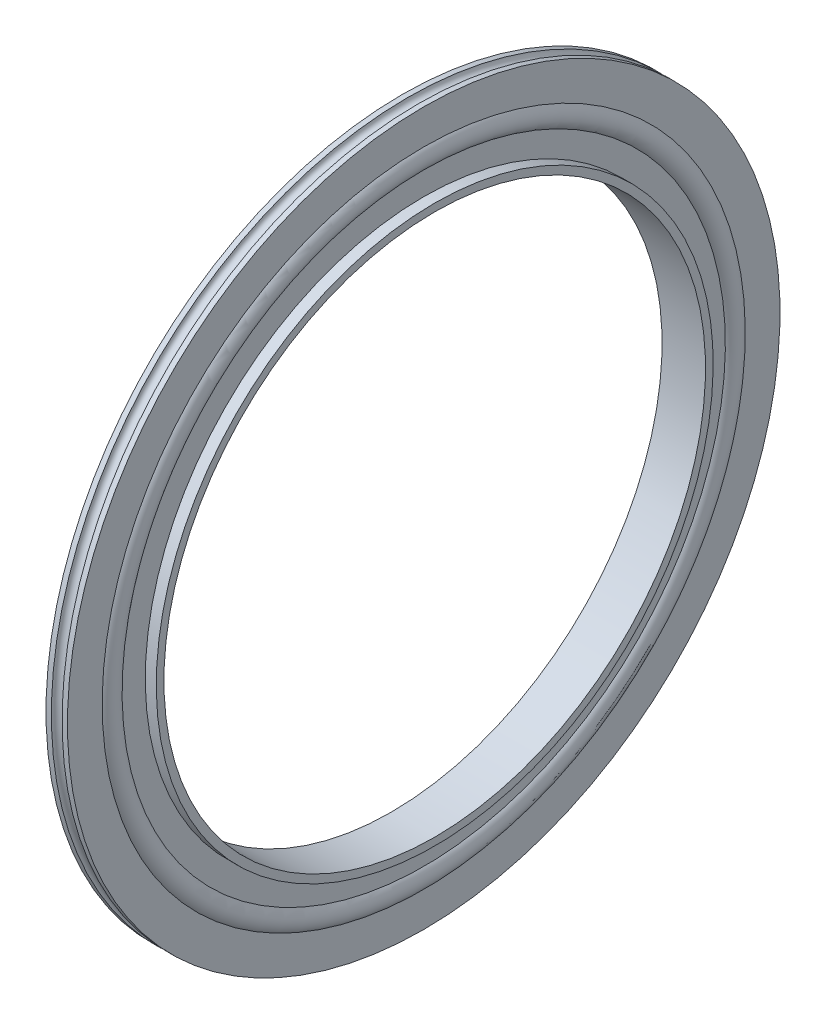
ISO-10303-21;
HEADER;
FILE_DESCRIPTION(('STEP AP214'),'2;1');
FILE_NAME('part.step','',(''),(''),'','','');
FILE_SCHEMA(('AUTOMOTIVE_DESIGN { 1 0 10303 214 1 1 1 1 }'));
ENDSEC;
DATA;
#1=APPLICATION_CONTEXT('core data for automotive mechanical design processes');
#2=APPLICATION_PROTOCOL_DEFINITION('international standard','automotive_design',2000,#1);
#3=PRODUCT_CONTEXT('',#1,'mechanical');
#4=PRODUCT('Part','Part','',(#3));
#5=PRODUCT_RELATED_PRODUCT_CATEGORY('part','',(#4));
#6=PRODUCT_DEFINITION_FORMATION('','',#4);
#7=PRODUCT_DEFINITION_CONTEXT('part definition',#1,'design');
#8=PRODUCT_DEFINITION('design','',#6,#7);
#9=PRODUCT_DEFINITION_SHAPE('','',#8);
#10=(LENGTH_UNIT() NAMED_UNIT(*) SI_UNIT(.MILLI.,.METRE.));
#11=(NAMED_UNIT(*) PLANE_ANGLE_UNIT() SI_UNIT($,.RADIAN.));
#12=(NAMED_UNIT(*) SI_UNIT($,.STERADIAN.) SOLID_ANGLE_UNIT());
#13=UNCERTAINTY_MEASURE_WITH_UNIT(LENGTH_MEASURE(1.E-05),#10,'distance_accuracy_value','');
#14=(GEOMETRIC_REPRESENTATION_CONTEXT(3) GLOBAL_UNCERTAINTY_ASSIGNED_CONTEXT((#13)) GLOBAL_UNIT_ASSIGNED_CONTEXT((#10,
#11,#12)) REPRESENTATION_CONTEXT('',''));
#15=CARTESIAN_POINT('',(0.,0.,0.));
#16=DIRECTION('',(0.,0.,1.));
#17=DIRECTION('',(1.,0.,0.));
#18=AXIS2_PLACEMENT_3D('',#15,#16,#17);
#19=CARTESIAN_POINT('',(0.,50.1015,0.));
#20=DIRECTION('',(-1.,0.,0.));
#21=DIRECTION('',(0.,0.,1.));
#22=AXIS2_PLACEMENT_3D('',#19,#20,#21);
#23=PLANE('',#22);
#24=CARTESIAN_POINT('',(0.,0.,0.));
#25=DIRECTION('',(-1.,0.,0.));
#26=DIRECTION('',(0.,1.,0.));
#27=AXIS2_PLACEMENT_3D('',#24,#25,#26);
#28=CIRCLE('',#27,49.403);
#29=CARTESIAN_POINT('',(0.,49.403,0.));
#30=VERTEX_POINT('',#29);
#31=EDGE_CURVE('E101',#30,#30,#28,.T.);
#32=ORIENTED_EDGE('',*,*,#31,.F.);
#33=EDGE_LOOP('',(#32));
#34=FACE_BOUND('',#33,.T.);
#35=CARTESIAN_POINT('',(0.,0.,0.));
#36=DIRECTION('',(-1.,0.,0.));
#37=DIRECTION('',(0.,1.,0.));
#38=AXIS2_PLACEMENT_3D('',#35,#36,#37);
#39=CIRCLE('',#38,50.8);
#40=CARTESIAN_POINT('',(0.,50.8,0.));
#41=VERTEX_POINT('',#40);
#42=EDGE_CURVE('E10',#41,#41,#39,.T.);
#43=ORIENTED_EDGE('',*,*,#42,.T.);
#44=EDGE_LOOP('',(#43));
#45=FACE_BOUND('',#44,.T.);
#46=ADVANCED_FACE('F15',(#34,#45),#23,.T.);
#47=CARTESIAN_POINT('',(1.0033,0.,0.));
#48=DIRECTION('',(-1.,0.,0.));
#49=DIRECTION('',(0.,1.,0.));
#50=AXIS2_PLACEMENT_3D('',#47,#48,#49);
#51=CYLINDRICAL_SURFACE('',#50,50.8);
#52=ORIENTED_EDGE('',*,*,#42,.F.);
#53=EDGE_LOOP('',(#52));
#54=FACE_BOUND('',#53,.T.);
#55=CARTESIAN_POINT('',(2.0066,0.,0.));
#56=DIRECTION('',(-1.,0.,0.));
#57=DIRECTION('',(0.,1.,0.));
#58=AXIS2_PLACEMENT_3D('',#55,#56,#57);
#59=CIRCLE('',#58,50.8);
#60=CARTESIAN_POINT('',(2.0066,50.8,0.));
#61=VERTEX_POINT('',#60);
#62=EDGE_CURVE('E105',#61,#61,#59,.T.);
#63=ORIENTED_EDGE('',*,*,#62,.T.);
#64=EDGE_LOOP('',(#63));
#65=FACE_BOUND('',#64,.T.);
#66=ADVANCED_FACE('F129',(#54,#65),#51,.T.);
#67=CARTESIAN_POINT('',(3.9624,0.,0.));
#68=DIRECTION('',(-1.,0.,0.));
#69=DIRECTION('',(0.,0.,1.));
#70=AXIS2_PLACEMENT_3D('',#67,#68,#69);
#71=TOROIDAL_SURFACE('',#70,56.8452,2.667);
#72=CARTESIAN_POINT('',(2.0066,0.,0.));
#73=DIRECTION('',(-1.,0.,0.));
#74=DIRECTION('',(0.,1.,0.));
#75=AXIS2_PLACEMENT_3D('',#72,#73,#74);
#76=CIRCLE('',#75,55.0319886609664);
#77=CARTESIAN_POINT('',(2.0066,55.0319886609664,0.));
#78=VERTEX_POINT('',#77);
#79=EDGE_CURVE('E109',#78,#78,#76,.T.);
#80=ORIENTED_EDGE('',*,*,#79,.F.);
#81=EDGE_LOOP('',(#80));
#82=FACE_BOUND('',#81,.T.);
#83=CARTESIAN_POINT('',(2.0066,0.,0.));
#84=DIRECTION('',(-1.,0.,0.));
#85=DIRECTION('',(0.,1.,0.));
#86=AXIS2_PLACEMENT_3D('',#83,#84,#85);
#87=CIRCLE('',#86,58.6584113390336);
#88=CARTESIAN_POINT('',(2.0066,58.6584113390336,0.));
#89=VERTEX_POINT('',#88);
#90=EDGE_CURVE('E25',#89,#89,#87,.T.);
#91=ORIENTED_EDGE('',*,*,#90,.T.);
#92=EDGE_LOOP('',(#91));
#93=FACE_BOUND('',#92,.T.);
#94=ADVANCED_FACE('F126',(#82,#93),#71,.T.);
#95=CARTESIAN_POINT('',(2.0066,61.8285056695168,0.));
#96=DIRECTION('',(-1.,0.,0.));
#97=DIRECTION('',(0.,0.,1.));
#98=AXIS2_PLACEMENT_3D('',#95,#96,#97);
#99=PLANE('',#98);
#100=ORIENTED_EDGE('',*,*,#90,.F.);
#101=EDGE_LOOP('',(#100));
#102=FACE_BOUND('',#101,.T.);
#103=CARTESIAN_POINT('',(2.0066,0.,0.));
#104=DIRECTION('',(-1.,0.,0.));
#105=DIRECTION('',(0.,1.,0.));
#106=AXIS2_PLACEMENT_3D('',#103,#104,#105);
#107=CIRCLE('',#106,64.9986);
#108=CARTESIAN_POINT('',(2.0066,64.9986,0.));
#109=VERTEX_POINT('',#108);
#110=EDGE_CURVE('E97',#109,#109,#107,.T.);
#111=ORIENTED_EDGE('',*,*,#110,.T.);
#112=EDGE_LOOP('',(#111));
#113=FACE_BOUND('',#112,.T.);
#114=ADVANCED_FACE('F128',(#102,#113),#99,.T.);
#115=CARTESIAN_POINT('',(6.9215,0.,0.));
#116=DIRECTION('',(-1.,0.,0.));
#117=DIRECTION('',(0.,1.,0.));
#118=AXIS2_PLACEMENT_3D('',#115,#116,#117);
#119=CYLINDRICAL_SURFACE('',#118,50.8);
#120=CARTESIAN_POINT('',(5.9182,0.,0.));
#121=DIRECTION('',(-1.,0.,0.));
#122=DIRECTION('',(0.,1.,0.));
#123=AXIS2_PLACEMENT_3D('',#120,#121,#122);
#124=CIRCLE('',#123,50.8);
#125=CARTESIAN_POINT('',(5.9182,50.8,0.));
#126=VERTEX_POINT('',#125);
#127=EDGE_CURVE('E117',#126,#126,#124,.T.);
#128=ORIENTED_EDGE('',*,*,#127,.F.);
#129=EDGE_LOOP('',(#128));
#130=FACE_BOUND('',#129,.T.);
#131=CARTESIAN_POINT('',(7.9248,0.,0.));
#132=DIRECTION('',(-1.,0.,0.));
#133=DIRECTION('',(0.,1.,0.));
#134=AXIS2_PLACEMENT_3D('',#131,#132,#133);
#135=CIRCLE('',#134,50.8);
#136=CARTESIAN_POINT('',(7.9248,50.8,0.));
#137=VERTEX_POINT('',#136);
#138=EDGE_CURVE('E108',#137,#137,#135,.T.);
#139=ORIENTED_EDGE('',*,*,#138,.T.);
#140=EDGE_LOOP('',(#139));
#141=FACE_BOUND('',#140,.T.);
#142=ADVANCED_FACE('F136',(#130,#141),#119,.T.);
#143=CARTESIAN_POINT('',(5.9182,52.9159943304832,0.));
#144=DIRECTION('',(1.,0.,0.));
#145=DIRECTION('',(0.,1.,0.));
#146=AXIS2_PLACEMENT_3D('',#143,#144,#145);
#147=PLANE('',#146);
#148=ORIENTED_EDGE('',*,*,#127,.T.);
#149=EDGE_LOOP('',(#148));
#150=FACE_BOUND('',#149,.T.);
#151=CARTESIAN_POINT('',(5.9182,0.,0.));
#152=DIRECTION('',(-1.,0.,0.));
#153=DIRECTION('',(0.,1.,0.));
#154=AXIS2_PLACEMENT_3D('',#151,#152,#153);
#155=CIRCLE('',#154,55.0319886609664);
#156=CARTESIAN_POINT('',(5.9182,55.0319886609664,0.));
#157=VERTEX_POINT('',#156);
#158=EDGE_CURVE('E94',#157,#157,#155,.T.);
#159=ORIENTED_EDGE('',*,*,#158,.F.);
#160=EDGE_LOOP('',(#159));
#161=FACE_BOUND('',#160,.T.);
#162=ADVANCED_FACE('F197',(#150,#161),#147,.T.);
#163=CARTESIAN_POINT('',(3.9624,0.,0.));
#164=DIRECTION('',(-1.,0.,0.));
#165=DIRECTION('',(0.,0.,1.));
#166=AXIS2_PLACEMENT_3D('',#163,#164,#165);
#167=TOROIDAL_SURFACE('',#166,56.8452,2.667);
#168=CARTESIAN_POINT('',(5.9182,0.,0.));
#169=DIRECTION('',(-1.,0.,0.));
#170=DIRECTION('',(0.,1.,0.));
#171=AXIS2_PLACEMENT_3D('',#168,#169,#170);
#172=CIRCLE('',#171,58.6584113390336);
#173=CARTESIAN_POINT('',(5.9182,58.6584113390336,0.));
#174=VERTEX_POINT('',#173);
#175=EDGE_CURVE('E88',#174,#174,#172,.T.);
#176=ORIENTED_EDGE('',*,*,#175,.F.);
#177=EDGE_LOOP('',(#176));
#178=FACE_BOUND('',#177,.T.);
#179=ORIENTED_EDGE('',*,*,#158,.T.);
#180=EDGE_LOOP('',(#179));
#181=FACE_BOUND('',#180,.T.);
#182=ADVANCED_FACE('F192',(#178,#181),#167,.T.);
#183=CARTESIAN_POINT('',(5.9182,61.8285056695168,0.));
#184=DIRECTION('',(1.,0.,0.));
#185=DIRECTION('',(0.,1.,0.));
#186=AXIS2_PLACEMENT_3D('',#183,#184,#185);
#187=PLANE('',#186);
#188=ORIENTED_EDGE('',*,*,#175,.T.);
#189=EDGE_LOOP('',(#188));
#190=FACE_BOUND('',#189,.T.);
#191=CARTESIAN_POINT('',(5.9182,0.,0.));
#192=DIRECTION('',(-1.,0.,0.));
#193=DIRECTION('',(0.,1.,0.));
#194=AXIS2_PLACEMENT_3D('',#191,#192,#193);
#195=CIRCLE('',#194,64.9986);
#196=CARTESIAN_POINT('',(5.9182,64.9986,0.));
#197=VERTEX_POINT('',#196);
#198=EDGE_CURVE('E84',#197,#197,#195,.T.);
#199=ORIENTED_EDGE('',*,*,#198,.F.);
#200=EDGE_LOOP('',(#199));
#201=FACE_BOUND('',#200,.T.);
#202=ADVANCED_FACE('F187',(#190,#201),#187,.T.);
#203=CARTESIAN_POINT('',(5.42925,0.,0.));
#204=DIRECTION('',(-1.,0.,0.));
#205=DIRECTION('',(0.,1.,0.));
#206=AXIS2_PLACEMENT_3D('',#203,#204,#205);
#207=CYLINDRICAL_SURFACE('',#206,64.9986);
#208=CARTESIAN_POINT('',(4.9403,0.,0.));
#209=DIRECTION('',(-1.,0.,0.));
#210=DIRECTION('',(0.,1.,0.));
#211=AXIS2_PLACEMENT_3D('',#208,#209,#210);
#212=CIRCLE('',#211,64.9986);
#213=CARTESIAN_POINT('',(4.9403,64.9986,0.));
#214=VERTEX_POINT('',#213);
#215=EDGE_CURVE('E89',#214,#214,#212,.T.);
#216=ORIENTED_EDGE('',*,*,#215,.F.);
#217=EDGE_LOOP('',(#216));
#218=FACE_BOUND('',#217,.T.);
#219=ORIENTED_EDGE('',*,*,#198,.T.);
#220=EDGE_LOOP('',(#219));
#221=FACE_BOUND('',#220,.T.);
#222=ADVANCED_FACE('F85',(#218,#221),#207,.T.);
#223=CARTESIAN_POINT('',(3.9624,0.,0.));
#224=DIRECTION('',(-1.,0.,0.));
#225=DIRECTION('',(0.,0.,1.));
#226=AXIS2_PLACEMENT_3D('',#223,#224,#225);
#227=TOROIDAL_SURFACE('',#226,64.9986,0.9779);
#228=CARTESIAN_POINT('',(2.9845,0.,0.));
#229=DIRECTION('',(-1.,0.,0.));
#230=DIRECTION('',(0.,1.,0.));
#231=AXIS2_PLACEMENT_3D('',#228,#229,#230);
#232=CIRCLE('',#231,64.9986);
#233=CARTESIAN_POINT('',(2.9845,64.9986,0.));
#234=VERTEX_POINT('',#233);
#235=EDGE_CURVE('E19',#234,#234,#232,.T.);
#236=ORIENTED_EDGE('',*,*,#235,.F.);
#237=EDGE_LOOP('',(#236));
#238=FACE_BOUND('',#237,.T.);
#239=ORIENTED_EDGE('',*,*,#215,.T.);
#240=EDGE_LOOP('',(#239));
#241=FACE_BOUND('',#240,.T.);
#242=ADVANCED_FACE('F160',(#238,#241),#227,.F.);
#243=CARTESIAN_POINT('',(2.49555,0.,0.));
#244=DIRECTION('',(-1.,0.,0.));
#245=DIRECTION('',(0.,1.,0.));
#246=AXIS2_PLACEMENT_3D('',#243,#244,#245);
#247=CYLINDRICAL_SURFACE('',#246,64.9986);
#248=ORIENTED_EDGE('',*,*,#110,.F.);
#249=EDGE_LOOP('',(#248));
#250=FACE_BOUND('',#249,.T.);
#251=ORIENTED_EDGE('',*,*,#235,.T.);
#252=EDGE_LOOP('',(#251));
#253=FACE_BOUND('',#252,.T.);
#254=ADVANCED_FACE('F152',(#250,#253),#247,.T.);
#255=CARTESIAN_POINT('',(7.9248,50.1015,0.));
#256=DIRECTION('',(1.,0.,0.));
#257=DIRECTION('',(0.,1.,0.));
#258=AXIS2_PLACEMENT_3D('',#255,#256,#257);
#259=PLANE('',#258);
#260=CARTESIAN_POINT('',(7.9248,0.,0.));
#261=DIRECTION('',(-1.,0.,0.));
#262=DIRECTION('',(0.,1.,0.));
#263=AXIS2_PLACEMENT_3D('',#260,#261,#262);
#264=CIRCLE('',#263,49.403);
#265=CARTESIAN_POINT('',(7.9248,49.403,0.));
#266=VERTEX_POINT('',#265);
#267=EDGE_CURVE('E104',#266,#266,#264,.T.);
#268=ORIENTED_EDGE('',*,*,#267,.T.);
#269=EDGE_LOOP('',(#268));
#270=FACE_BOUND('',#269,.T.);
#271=ORIENTED_EDGE('',*,*,#138,.F.);
#272=EDGE_LOOP('',(#271));
#273=FACE_BOUND('',#272,.T.);
#274=ADVANCED_FACE('F150',(#270,#273),#259,.T.);
#275=CARTESIAN_POINT('',(2.0066,52.9159943304832,0.));
#276=DIRECTION('',(-1.,0.,0.));
#277=DIRECTION('',(0.,0.,1.));
#278=AXIS2_PLACEMENT_3D('',#275,#276,#277);
#279=PLANE('',#278);
#280=ORIENTED_EDGE('',*,*,#62,.F.);
#281=EDGE_LOOP('',(#280));
#282=FACE_BOUND('',#281,.T.);
#283=ORIENTED_EDGE('',*,*,#79,.T.);
#284=EDGE_LOOP('',(#283));
#285=FACE_BOUND('',#284,.T.);
#286=ADVANCED_FACE('F17',(#282,#285),#279,.T.);
#287=CARTESIAN_POINT('',(3.9624,0.,0.));
#288=DIRECTION('',(-1.,0.,0.));
#289=DIRECTION('',(0.,1.,0.));
#290=AXIS2_PLACEMENT_3D('',#287,#288,#289);
#291=CYLINDRICAL_SURFACE('',#290,49.403);
#292=ORIENTED_EDGE('',*,*,#267,.F.);
#293=EDGE_LOOP('',(#292));
#294=FACE_BOUND('',#293,.T.);
#295=ORIENTED_EDGE('',*,*,#31,.T.);
#296=EDGE_LOOP('',(#295));
#297=FACE_BOUND('',#296,.T.);
#298=ADVANCED_FACE('F158',(#294,#297),#291,.F.);
#299=CLOSED_SHELL('',(#46,#66,#94,#114,#142,#162,#182,#202,#222,#242,#254,#274,#286,#298));
#300=MANIFOLD_SOLID_BREP('B1',#299);
#301=ADVANCED_BREP_SHAPE_REPRESENTATION('',(#18,#300),#14);
#302=SHAPE_DEFINITION_REPRESENTATION(#9,#301);
ENDSEC;
END-ISO-10303-21;
